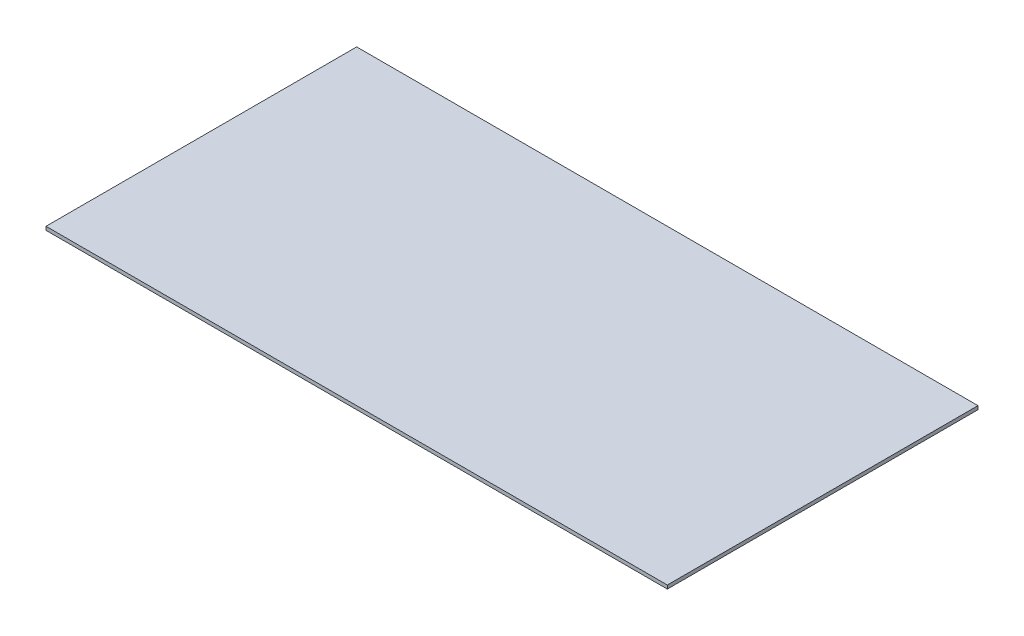
ISO-10303-21;
HEADER;
FILE_DESCRIPTION(('STEP AP214'),'2;1');
FILE_NAME('part.step','',(''),(''),'','','');
FILE_SCHEMA(('AUTOMOTIVE_DESIGN { 1 0 10303 214 1 1 1 1 }'));
ENDSEC;
DATA;
#1=APPLICATION_CONTEXT('core data for automotive mechanical design processes');
#2=APPLICATION_PROTOCOL_DEFINITION('international standard','automotive_design',2000,#1);
#3=PRODUCT_CONTEXT('',#1,'mechanical');
#4=PRODUCT('Part','Part','',(#3));
#5=PRODUCT_RELATED_PRODUCT_CATEGORY('part','',(#4));
#6=PRODUCT_DEFINITION_FORMATION('','',#4);
#7=PRODUCT_DEFINITION_CONTEXT('part definition',#1,'design');
#8=PRODUCT_DEFINITION('design','',#6,#7);
#9=PRODUCT_DEFINITION_SHAPE('','',#8);
#10=(LENGTH_UNIT() NAMED_UNIT(*) SI_UNIT(.MILLI.,.METRE.));
#11=(NAMED_UNIT(*) PLANE_ANGLE_UNIT() SI_UNIT($,.RADIAN.));
#12=(NAMED_UNIT(*) SI_UNIT($,.STERADIAN.) SOLID_ANGLE_UNIT());
#13=UNCERTAINTY_MEASURE_WITH_UNIT(LENGTH_MEASURE(1.E-05),#10,'distance_accuracy_value','');
#14=(GEOMETRIC_REPRESENTATION_CONTEXT(3) GLOBAL_UNCERTAINTY_ASSIGNED_CONTEXT((#13)) GLOBAL_UNIT_ASSIGNED_CONTEXT((#10,
#11,#12)) REPRESENTATION_CONTEXT('',''));
#15=CARTESIAN_POINT('',(0.,0.,0.));
#16=DIRECTION('',(0.,0.,1.));
#17=DIRECTION('',(1.,0.,0.));
#18=AXIS2_PLACEMENT_3D('',#15,#16,#17);
#19=CARTESIAN_POINT('',(140.,1.6,-70.));
#20=DIRECTION('',(-1.,0.,0.));
#21=DIRECTION('',(0.,0.,1.));
#22=AXIS2_PLACEMENT_3D('',#19,#20,#21);
#23=PLANE('',#22);
#24=DIRECTION('',(0.,0.,-1.));
#25=VECTOR('',#24,1.);
#26=CARTESIAN_POINT('',(140.,0.,-70.));
#27=LINE('',#26,#25);
#28=CARTESIAN_POINT('',(140.,0.,70.));
#29=VERTEX_POINT('',#28);
#30=CARTESIAN_POINT('',(140.,0.,-70.));
#31=VERTEX_POINT('',#30);
#32=EDGE_CURVE('E107',#29,#31,#27,.T.);
#33=ORIENTED_EDGE('',*,*,#32,.T.);
#34=DIRECTION('',(0.,-1.,0.));
#35=VECTOR('',#34,1.);
#36=CARTESIAN_POINT('',(140.,1.6,-70.));
#37=LINE('',#36,#35);
#38=CARTESIAN_POINT('',(140.,1.6,-70.));
#39=VERTEX_POINT('',#38);
#40=EDGE_CURVE('E11',#39,#31,#37,.T.);
#41=ORIENTED_EDGE('',*,*,#40,.F.);
#42=DIRECTION('',(0.,0.,-1.));
#43=VECTOR('',#42,1.);
#44=CARTESIAN_POINT('',(140.,1.6,-70.));
#45=LINE('',#44,#43);
#46=CARTESIAN_POINT('',(140.,1.6,70.));
#47=VERTEX_POINT('',#46);
#48=EDGE_CURVE('E91',#47,#39,#45,.T.);
#49=ORIENTED_EDGE('',*,*,#48,.F.);
#50=DIRECTION('',(0.,-1.,0.));
#51=VECTOR('',#50,1.);
#52=CARTESIAN_POINT('',(140.,1.6,70.));
#53=LINE('',#52,#51);
#54=EDGE_CURVE('E103',#47,#29,#53,.T.);
#55=ORIENTED_EDGE('',*,*,#54,.T.);
#56=EDGE_LOOP('',(#33,#41,#49,#55));
#57=FACE_BOUND('',#56,.T.);
#58=ADVANCED_FACE('F39',(#57),#23,.F.);
#59=CARTESIAN_POINT('',(-140.,1.6,-70.));
#60=DIRECTION('',(0.,0.,1.));
#61=DIRECTION('',(1.,0.,0.));
#62=AXIS2_PLACEMENT_3D('',#59,#60,#61);
#63=PLANE('',#62);
#64=DIRECTION('',(-1.,0.,0.));
#65=VECTOR('',#64,1.);
#66=CARTESIAN_POINT('',(-140.,0.,-70.));
#67=LINE('',#66,#65);
#68=CARTESIAN_POINT('',(-140.,0.,-70.));
#69=VERTEX_POINT('',#68);
#70=EDGE_CURVE('E96',#31,#69,#67,.T.);
#71=ORIENTED_EDGE('',*,*,#70,.T.);
#72=DIRECTION('',(0.,-1.,0.));
#73=VECTOR('',#72,1.);
#74=CARTESIAN_POINT('',(-140.,1.6,-70.));
#75=LINE('',#74,#73);
#76=CARTESIAN_POINT('',(-140.,1.6,-70.));
#77=VERTEX_POINT('',#76);
#78=EDGE_CURVE('E48',#77,#69,#75,.T.);
#79=ORIENTED_EDGE('',*,*,#78,.F.);
#80=DIRECTION('',(-1.,0.,0.));
#81=VECTOR('',#80,1.);
#82=CARTESIAN_POINT('',(-140.,1.6,-70.));
#83=LINE('',#82,#81);
#84=EDGE_CURVE('E86',#39,#77,#83,.T.);
#85=ORIENTED_EDGE('',*,*,#84,.F.);
#86=ORIENTED_EDGE('',*,*,#40,.T.);
#87=EDGE_LOOP('',(#71,#79,#85,#86));
#88=FACE_BOUND('',#87,.T.);
#89=ADVANCED_FACE('F95',(#88),#63,.F.);
#90=CARTESIAN_POINT('',(-140.,1.6,-70.));
#91=DIRECTION('',(1.,0.,0.));
#92=DIRECTION('',(0.,0.,-1.));
#93=AXIS2_PLACEMENT_3D('',#90,#91,#92);
#94=PLANE('',#93);
#95=DIRECTION('',(0.,0.,1.));
#96=VECTOR('',#95,1.);
#97=CARTESIAN_POINT('',(-140.,0.,-70.));
#98=LINE('',#97,#96);
#99=CARTESIAN_POINT('',(-140.,0.,70.));
#100=VERTEX_POINT('',#99);
#101=EDGE_CURVE('E73',#69,#100,#98,.T.);
#102=ORIENTED_EDGE('',*,*,#101,.T.);
#103=DIRECTION('',(0.,-1.,0.));
#104=VECTOR('',#103,1.);
#105=CARTESIAN_POINT('',(-140.,1.6,70.));
#106=LINE('',#105,#104);
#107=CARTESIAN_POINT('',(-140.,1.6,70.));
#108=VERTEX_POINT('',#107);
#109=EDGE_CURVE('E98',#108,#100,#106,.T.);
#110=ORIENTED_EDGE('',*,*,#109,.F.);
#111=DIRECTION('',(0.,0.,1.));
#112=VECTOR('',#111,1.);
#113=CARTESIAN_POINT('',(-140.,1.6,-70.));
#114=LINE('',#113,#112);
#115=EDGE_CURVE('E89',#77,#108,#114,.T.);
#116=ORIENTED_EDGE('',*,*,#115,.F.);
#117=ORIENTED_EDGE('',*,*,#78,.T.);
#118=EDGE_LOOP('',(#102,#110,#116,#117));
#119=FACE_BOUND('',#118,.T.);
#120=ADVANCED_FACE('F99',(#119),#94,.F.);
#121=CARTESIAN_POINT('',(-140.,1.6,70.));
#122=DIRECTION('',(0.,0.,-1.));
#123=DIRECTION('',(-1.,0.,0.));
#124=AXIS2_PLACEMENT_3D('',#121,#122,#123);
#125=PLANE('',#124);
#126=DIRECTION('',(1.,0.,0.));
#127=VECTOR('',#126,1.);
#128=CARTESIAN_POINT('',(-140.,0.,70.));
#129=LINE('',#128,#127);
#130=EDGE_CURVE('E79',#100,#29,#129,.T.);
#131=ORIENTED_EDGE('',*,*,#130,.T.);
#132=ORIENTED_EDGE('',*,*,#54,.F.);
#133=DIRECTION('',(1.,0.,0.));
#134=VECTOR('',#133,1.);
#135=CARTESIAN_POINT('',(-140.,1.6,70.));
#136=LINE('',#135,#134);
#137=EDGE_CURVE('E56',#108,#47,#136,.T.);
#138=ORIENTED_EDGE('',*,*,#137,.F.);
#139=ORIENTED_EDGE('',*,*,#109,.T.);
#140=EDGE_LOOP('',(#131,#132,#138,#139));
#141=FACE_BOUND('',#140,.T.);
#142=ADVANCED_FACE('F120',(#141),#125,.F.);
#143=CARTESIAN_POINT('',(0.,1.6,0.));
#144=DIRECTION('',(0.,1.,0.));
#145=DIRECTION('',(0.,0.,1.));
#146=AXIS2_PLACEMENT_3D('',#143,#144,#145);
#147=PLANE('',#146);
#148=ORIENTED_EDGE('',*,*,#48,.T.);
#149=ORIENTED_EDGE('',*,*,#84,.T.);
#150=ORIENTED_EDGE('',*,*,#115,.T.);
#151=ORIENTED_EDGE('',*,*,#137,.T.);
#152=EDGE_LOOP('',(#148,#149,#150,#151));
#153=FACE_BOUND('',#152,.T.);
#154=ADVANCED_FACE('F87',(#153),#147,.T.);
#155=CARTESIAN_POINT('',(0.,0.,0.));
#156=DIRECTION('',(0.,1.,0.));
#157=DIRECTION('',(0.,0.,1.));
#158=AXIS2_PLACEMENT_3D('',#155,#156,#157);
#159=PLANE('',#158);
#160=ORIENTED_EDGE('',*,*,#32,.F.);
#161=ORIENTED_EDGE('',*,*,#130,.F.);
#162=ORIENTED_EDGE('',*,*,#101,.F.);
#163=ORIENTED_EDGE('',*,*,#70,.F.);
#164=EDGE_LOOP('',(#160,#161,#162,#163));
#165=FACE_BOUND('',#164,.T.);
#166=ADVANCED_FACE('F123',(#165),#159,.F.);
#167=CLOSED_SHELL('',(#58,#89,#120,#142,#154,#166));
#168=MANIFOLD_SOLID_BREP('B2',#167);
#169=ADVANCED_BREP_SHAPE_REPRESENTATION('',(#18,#168),#14);
#170=SHAPE_DEFINITION_REPRESENTATION(#9,#169);
ENDSEC;
END-ISO-10303-21;
